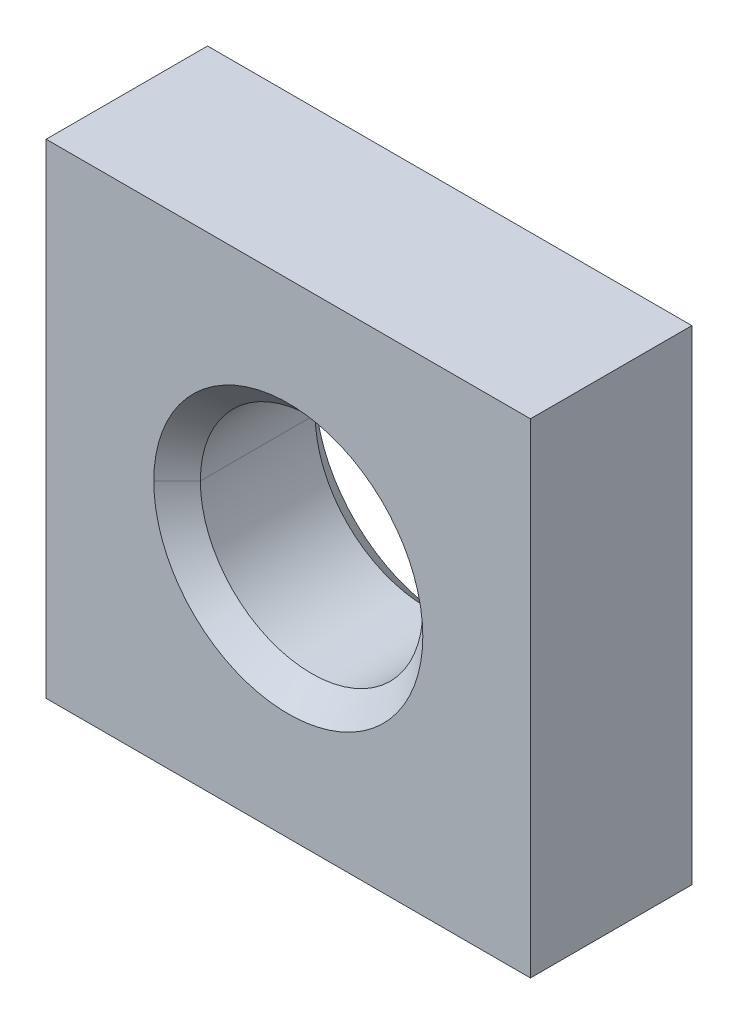
ISO-10303-21;
HEADER;
FILE_DESCRIPTION(('STEP AP214'),'2;1');
FILE_NAME('part.step','',(''),(''),'','','');
FILE_SCHEMA(('AUTOMOTIVE_DESIGN { 1 0 10303 214 1 1 1 1 }'));
ENDSEC;
DATA;
#1=APPLICATION_CONTEXT('core data for automotive mechanical design processes');
#2=APPLICATION_PROTOCOL_DEFINITION('international standard','automotive_design',2000,#1);
#3=PRODUCT_CONTEXT('',#1,'mechanical');
#4=PRODUCT('Part','Part','',(#3));
#5=PRODUCT_RELATED_PRODUCT_CATEGORY('part','',(#4));
#6=PRODUCT_DEFINITION_FORMATION('','',#4);
#7=PRODUCT_DEFINITION_CONTEXT('part definition',#1,'design');
#8=PRODUCT_DEFINITION('design','',#6,#7);
#9=PRODUCT_DEFINITION_SHAPE('','',#8);
#10=(LENGTH_UNIT() NAMED_UNIT(*) SI_UNIT(.MILLI.,.METRE.));
#11=(NAMED_UNIT(*) PLANE_ANGLE_UNIT() SI_UNIT($,.RADIAN.));
#12=(NAMED_UNIT(*) SI_UNIT($,.STERADIAN.) SOLID_ANGLE_UNIT());
#13=UNCERTAINTY_MEASURE_WITH_UNIT(LENGTH_MEASURE(1.E-05),#10,'distance_accuracy_value','');
#14=(GEOMETRIC_REPRESENTATION_CONTEXT(3) GLOBAL_UNCERTAINTY_ASSIGNED_CONTEXT((#13)) GLOBAL_UNIT_ASSIGNED_CONTEXT((#10,
#11,#12)) REPRESENTATION_CONTEXT('',''));
#15=CARTESIAN_POINT('',(0.,0.,0.));
#16=DIRECTION('',(0.,0.,1.));
#17=DIRECTION('',(1.,0.,0.));
#18=AXIS2_PLACEMENT_3D('',#15,#16,#17);
#19=CARTESIAN_POINT('',(0.,0.,-3.));
#20=DIRECTION('',(0.,0.,1.));
#21=DIRECTION('',(1.,0.,0.));
#22=AXIS2_PLACEMENT_3D('',#19,#20,#21);
#23=PLANE('',#22);
#24=CARTESIAN_POINT('',(0.,0.,-3.));
#25=DIRECTION('',(0.,0.,-1.));
#26=DIRECTION('',(-1.,0.,0.));
#27=AXIS2_PLACEMENT_3D('',#24,#25,#26);
#28=CIRCLE('',#27,2.5);
#29=CARTESIAN_POINT('',(-2.5,0.,-3.));
#30=VERTEX_POINT('',#29);
#31=CARTESIAN_POINT('',(2.5000000000011,0.,-2.9999999999989));
#32=VERTEX_POINT('',#31);
#33=EDGE_CURVE('E10',#30,#32,#28,.T.);
#34=ORIENTED_EDGE('',*,*,#33,.F.);
#35=CARTESIAN_POINT('',(0.,0.,-3.));
#36=DIRECTION('',(0.,0.,-1.));
#37=DIRECTION('',(-1.,0.,0.));
#38=AXIS2_PLACEMENT_3D('',#35,#36,#37);
#39=CIRCLE('',#38,2.5);
#40=EDGE_CURVE('E24',#32,#30,#39,.T.);
#41=ORIENTED_EDGE('',*,*,#40,.F.);
#42=EDGE_LOOP('',(#34,#41));
#43=FACE_BOUND('',#42,.T.);
#44=DIRECTION('',(-1.,0.,0.));
#45=VECTOR('',#44,1.);
#46=CARTESIAN_POINT('',(4.5,4.5,-3.));
#47=LINE('',#46,#45);
#48=CARTESIAN_POINT('',(4.5,4.5,-3.));
#49=VERTEX_POINT('',#48);
#50=CARTESIAN_POINT('',(-4.5,4.5,-3.));
#51=VERTEX_POINT('',#50);
#52=EDGE_CURVE('E185',#49,#51,#47,.T.);
#53=ORIENTED_EDGE('',*,*,#52,.F.);
#54=DIRECTION('',(0.,1.,0.));
#55=VECTOR('',#54,1.);
#56=CARTESIAN_POINT('',(4.5,-4.5,-3.));
#57=LINE('',#56,#55);
#58=CARTESIAN_POINT('',(4.5,-4.5,-3.));
#59=VERTEX_POINT('',#58);
#60=EDGE_CURVE('E180',#59,#49,#57,.T.);
#61=ORIENTED_EDGE('',*,*,#60,.F.);
#62=DIRECTION('',(1.,0.,0.));
#63=VECTOR('',#62,1.);
#64=CARTESIAN_POINT('',(-4.5,-4.5,-3.));
#65=LINE('',#64,#63);
#66=CARTESIAN_POINT('',(-4.5,-4.5,-3.));
#67=VERTEX_POINT('',#66);
#68=EDGE_CURVE('E175',#67,#59,#65,.T.);
#69=ORIENTED_EDGE('',*,*,#68,.F.);
#70=DIRECTION('',(0.,-1.,0.));
#71=VECTOR('',#70,1.);
#72=CARTESIAN_POINT('',(-4.5,4.5,-3.));
#73=LINE('',#72,#71);
#74=EDGE_CURVE('E170',#51,#67,#73,.T.);
#75=ORIENTED_EDGE('',*,*,#74,.F.);
#76=EDGE_LOOP('',(#53,#61,#69,#75));
#77=FACE_BOUND('',#76,.T.);
#78=ADVANCED_FACE('F16',(#43,#77),#23,.F.);
#79=CARTESIAN_POINT('',(-4.5,4.5,-3.));
#80=DIRECTION('',(-1.,0.,0.));
#81=DIRECTION('',(0.,0.,1.));
#82=AXIS2_PLACEMENT_3D('',#79,#80,#81);
#83=PLANE('',#82);
#84=DIRECTION('',(0.,-1.,0.));
#85=VECTOR('',#84,1.);
#86=CARTESIAN_POINT('',(-4.5,4.5,0.));
#87=LINE('',#86,#85);
#88=CARTESIAN_POINT('',(-4.5,4.5,0.));
#89=VERTEX_POINT('',#88);
#90=CARTESIAN_POINT('',(-4.5,-4.5,0.));
#91=VERTEX_POINT('',#90);
#92=EDGE_CURVE('E165',#89,#91,#87,.T.);
#93=ORIENTED_EDGE('',*,*,#92,.F.);
#94=DIRECTION('',(0.,0.,1.));
#95=VECTOR('',#94,1.);
#96=CARTESIAN_POINT('',(-4.5,4.5,-3.));
#97=LINE('',#96,#95);
#98=EDGE_CURVE('E160',#51,#89,#97,.T.);
#99=ORIENTED_EDGE('',*,*,#98,.F.);
#100=ORIENTED_EDGE('',*,*,#74,.T.);
#101=DIRECTION('',(0.,0.,1.));
#102=VECTOR('',#101,1.);
#103=CARTESIAN_POINT('',(-4.5,-4.5,-3.));
#104=LINE('',#103,#102);
#105=EDGE_CURVE('E156',#67,#91,#104,.T.);
#106=ORIENTED_EDGE('',*,*,#105,.T.);
#107=EDGE_LOOP('',(#93,#99,#100,#106));
#108=FACE_BOUND('',#107,.T.);
#109=ADVANCED_FACE('F209',(#108),#83,.T.);
#110=CARTESIAN_POINT('',(-4.5,-4.5,-3.));
#111=DIRECTION('',(0.,-1.,0.));
#112=DIRECTION('',(0.,0.,-1.));
#113=AXIS2_PLACEMENT_3D('',#110,#111,#112);
#114=PLANE('',#113);
#115=DIRECTION('',(1.,0.,0.));
#116=VECTOR('',#115,1.);
#117=CARTESIAN_POINT('',(-4.5,-4.5,0.));
#118=LINE('',#117,#116);
#119=CARTESIAN_POINT('',(4.5,-4.5,0.));
#120=VERTEX_POINT('',#119);
#121=EDGE_CURVE('E151',#91,#120,#118,.T.);
#122=ORIENTED_EDGE('',*,*,#121,.F.);
#123=ORIENTED_EDGE('',*,*,#105,.F.);
#124=ORIENTED_EDGE('',*,*,#68,.T.);
#125=DIRECTION('',(0.,0.,1.));
#126=VECTOR('',#125,1.);
#127=CARTESIAN_POINT('',(4.5,-4.5,-3.));
#128=LINE('',#127,#126);
#129=EDGE_CURVE('E147',#59,#120,#128,.T.);
#130=ORIENTED_EDGE('',*,*,#129,.T.);
#131=EDGE_LOOP('',(#122,#123,#124,#130));
#132=FACE_BOUND('',#131,.T.);
#133=ADVANCED_FACE('F206',(#132),#114,.T.);
#134=CARTESIAN_POINT('',(4.5,-4.5,-3.));
#135=DIRECTION('',(1.,0.,0.));
#136=DIRECTION('',(0.,0.,-1.));
#137=AXIS2_PLACEMENT_3D('',#134,#135,#136);
#138=PLANE('',#137);
#139=DIRECTION('',(0.,1.,0.));
#140=VECTOR('',#139,1.);
#141=CARTESIAN_POINT('',(4.5,-4.5,0.));
#142=LINE('',#141,#140);
#143=CARTESIAN_POINT('',(4.5,4.5,0.));
#144=VERTEX_POINT('',#143);
#145=EDGE_CURVE('E142',#120,#144,#142,.T.);
#146=ORIENTED_EDGE('',*,*,#145,.F.);
#147=ORIENTED_EDGE('',*,*,#129,.F.);
#148=ORIENTED_EDGE('',*,*,#60,.T.);
#149=DIRECTION('',(0.,0.,1.));
#150=VECTOR('',#149,1.);
#151=CARTESIAN_POINT('',(4.5,4.5,-3.));
#152=LINE('',#151,#150);
#153=EDGE_CURVE('E138',#49,#144,#152,.T.);
#154=ORIENTED_EDGE('',*,*,#153,.T.);
#155=EDGE_LOOP('',(#146,#147,#148,#154));
#156=FACE_BOUND('',#155,.T.);
#157=ADVANCED_FACE('F203',(#156),#138,.T.);
#158=CARTESIAN_POINT('',(4.5,4.5,-3.));
#159=DIRECTION('',(0.,1.,0.));
#160=DIRECTION('',(0.,0.,1.));
#161=AXIS2_PLACEMENT_3D('',#158,#159,#160);
#162=PLANE('',#161);
#163=DIRECTION('',(-1.,0.,0.));
#164=VECTOR('',#163,1.);
#165=CARTESIAN_POINT('',(4.5,4.5,0.));
#166=LINE('',#165,#164);
#167=EDGE_CURVE('E133',#144,#89,#166,.T.);
#168=ORIENTED_EDGE('',*,*,#167,.F.);
#169=ORIENTED_EDGE('',*,*,#153,.F.);
#170=ORIENTED_EDGE('',*,*,#52,.T.);
#171=ORIENTED_EDGE('',*,*,#98,.T.);
#172=EDGE_LOOP('',(#168,#169,#170,#171));
#173=FACE_BOUND('',#172,.T.);
#174=ADVANCED_FACE('F197',(#173),#162,.T.);
#175=CARTESIAN_POINT('',(0.,0.,0.));
#176=DIRECTION('',(0.,0.,1.));
#177=DIRECTION('',(1.,0.,0.));
#178=AXIS2_PLACEMENT_3D('',#175,#176,#177);
#179=PLANE('',#178);
#180=CARTESIAN_POINT('',(0.,0.,0.));
#181=DIRECTION('',(0.,0.,-1.));
#182=DIRECTION('',(-1.,0.,0.));
#183=AXIS2_PLACEMENT_3D('',#180,#181,#182);
#184=CIRCLE('',#183,2.5);
#185=CARTESIAN_POINT('',(-2.5,0.,0.));
#186=VERTEX_POINT('',#185);
#187=CARTESIAN_POINT('',(2.5,0.,0.));
#188=VERTEX_POINT('',#187);
#189=EDGE_CURVE('E129',#186,#188,#184,.T.);
#190=ORIENTED_EDGE('',*,*,#189,.T.);
#191=CARTESIAN_POINT('',(0.,0.,0.));
#192=DIRECTION('',(0.,0.,-1.));
#193=DIRECTION('',(-1.,0.,0.));
#194=AXIS2_PLACEMENT_3D('',#191,#192,#193);
#195=CIRCLE('',#194,2.5);
#196=EDGE_CURVE('E125',#188,#186,#195,.T.);
#197=ORIENTED_EDGE('',*,*,#196,.T.);
#198=EDGE_LOOP('',(#190,#197));
#199=FACE_BOUND('',#198,.T.);
#200=ORIENTED_EDGE('',*,*,#167,.T.);
#201=ORIENTED_EDGE('',*,*,#92,.T.);
#202=ORIENTED_EDGE('',*,*,#121,.T.);
#203=ORIENTED_EDGE('',*,*,#145,.T.);
#204=EDGE_LOOP('',(#200,#201,#202,#203));
#205=FACE_BOUND('',#204,.T.);
#206=ADVANCED_FACE('F211',(#199,#205),#179,.T.);
#207=CARTESIAN_POINT('',(0.,0.,0.));
#208=DIRECTION('',(0.,0.,1.));
#209=DIRECTION('',(0.,1.,0.));
#210=AXIS2_PLACEMENT_3D('',#207,#208,#209);
#211=CONICAL_SURFACE('',#210,2.5,0.7853981634);
#212=ORIENTED_EDGE('',*,*,#196,.F.);
#213=DIRECTION('',(0.707106781188352,0.,0.707106781184743));
#214=VECTOR('',#213,1.);
#215=CARTESIAN_POINT('',(2.0669999999989,0.,-0.432999999998895));
#216=LINE('',#215,#214);
#217=CARTESIAN_POINT('',(2.0669999999989,0.,-0.432999999998895));
#218=VERTEX_POINT('',#217);
#219=EDGE_CURVE('E120',#218,#188,#216,.T.);
#220=ORIENTED_EDGE('',*,*,#219,.F.);
#221=CARTESIAN_POINT('',(0.,0.,-0.433));
#222=DIRECTION('',(0.,0.,-1.));
#223=DIRECTION('',(-1.,0.,0.));
#224=AXIS2_PLACEMENT_3D('',#221,#222,#223);
#225=CIRCLE('',#224,2.067);
#226=CARTESIAN_POINT('',(-2.067,0.,-0.433));
#227=VERTEX_POINT('',#226);
#228=EDGE_CURVE('E116',#218,#227,#225,.T.);
#229=ORIENTED_EDGE('',*,*,#228,.T.);
#230=DIRECTION('',(-0.707106781188352,0.,0.707106781184743));
#231=VECTOR('',#230,1.);
#232=CARTESIAN_POINT('',(-2.0669999999989,0.,-0.432999999998895));
#233=LINE('',#232,#231);
#234=EDGE_CURVE('E104',#227,#186,#233,.T.);
#235=ORIENTED_EDGE('',*,*,#234,.T.);
#236=EDGE_LOOP('',(#212,#220,#229,#235));
#237=FACE_BOUND('',#236,.T.);
#238=ADVANCED_FACE('F213',(#237),#211,.F.);
#239=CARTESIAN_POINT('',(0.,0.,0.));
#240=DIRECTION('',(0.,0.,1.));
#241=DIRECTION('',(0.,-1.,0.));
#242=AXIS2_PLACEMENT_3D('',#239,#240,#241);
#243=CONICAL_SURFACE('',#242,2.5,0.7853981634);
#244=CARTESIAN_POINT('',(0.,0.,-0.433));
#245=DIRECTION('',(0.,0.,-1.));
#246=DIRECTION('',(-1.,0.,0.));
#247=AXIS2_PLACEMENT_3D('',#244,#245,#246);
#248=CIRCLE('',#247,2.067);
#249=EDGE_CURVE('E84',#227,#218,#248,.T.);
#250=ORIENTED_EDGE('',*,*,#249,.T.);
#251=ORIENTED_EDGE('',*,*,#219,.T.);
#252=ORIENTED_EDGE('',*,*,#189,.F.);
#253=ORIENTED_EDGE('',*,*,#234,.F.);
#254=EDGE_LOOP('',(#250,#251,#252,#253));
#255=FACE_BOUND('',#254,.T.);
#256=ADVANCED_FACE('F221',(#255),#243,.F.);
#257=CARTESIAN_POINT('',(0.,0.,-3.));
#258=DIRECTION('',(0.,0.,1.));
#259=DIRECTION('',(0.,-1.,0.));
#260=AXIS2_PLACEMENT_3D('',#257,#258,#259);
#261=CYLINDRICAL_SURFACE('',#260,2.067);
#262=CARTESIAN_POINT('',(0.,0.,-2.567));
#263=DIRECTION('',(0.,0.,-1.));
#264=DIRECTION('',(-1.,0.,0.));
#265=AXIS2_PLACEMENT_3D('',#262,#263,#264);
#266=CIRCLE('',#265,2.067);
#267=CARTESIAN_POINT('',(-2.067,0.,-2.567));
#268=VERTEX_POINT('',#267);
#269=CARTESIAN_POINT('',(2.067,0.,-2.567));
#270=VERTEX_POINT('',#269);
#271=EDGE_CURVE('E81',#268,#270,#266,.T.);
#272=ORIENTED_EDGE('',*,*,#271,.T.);
#273=DIRECTION('',(0.,0.,1.));
#274=VECTOR('',#273,1.);
#275=CARTESIAN_POINT('',(2.067,0.,-2.567));
#276=LINE('',#275,#274);
#277=EDGE_CURVE('E87',#270,#218,#276,.T.);
#278=ORIENTED_EDGE('',*,*,#277,.T.);
#279=ORIENTED_EDGE('',*,*,#249,.F.);
#280=DIRECTION('',(0.,0.,1.));
#281=VECTOR('',#280,1.);
#282=CARTESIAN_POINT('',(-2.067,0.,-2.567));
#283=LINE('',#282,#281);
#284=EDGE_CURVE('E76',#268,#227,#283,.T.);
#285=ORIENTED_EDGE('',*,*,#284,.F.);
#286=EDGE_LOOP('',(#272,#278,#279,#285));
#287=FACE_BOUND('',#286,.T.);
#288=ADVANCED_FACE('F78',(#287),#261,.F.);
#289=CARTESIAN_POINT('',(0.,0.,-3.));
#290=DIRECTION('',(0.,0.,1.));
#291=DIRECTION('',(0.,1.,0.));
#292=AXIS2_PLACEMENT_3D('',#289,#290,#291);
#293=CYLINDRICAL_SURFACE('',#292,2.067);
#294=ORIENTED_EDGE('',*,*,#228,.F.);
#295=ORIENTED_EDGE('',*,*,#277,.F.);
#296=CARTESIAN_POINT('',(0.,0.,-2.567));
#297=DIRECTION('',(0.,0.,-1.));
#298=DIRECTION('',(-1.,0.,0.));
#299=AXIS2_PLACEMENT_3D('',#296,#297,#298);
#300=CIRCLE('',#299,2.067);
#301=EDGE_CURVE('E88',#270,#268,#300,.T.);
#302=ORIENTED_EDGE('',*,*,#301,.T.);
#303=ORIENTED_EDGE('',*,*,#284,.T.);
#304=EDGE_LOOP('',(#294,#295,#302,#303));
#305=FACE_BOUND('',#304,.T.);
#306=ADVANCED_FACE('F92',(#305),#293,.F.);
#307=CARTESIAN_POINT('',(0.,0.,-2.567));
#308=DIRECTION('',(0.,0.,-1.));
#309=DIRECTION('',(0.,1.,0.));
#310=AXIS2_PLACEMENT_3D('',#307,#308,#309);
#311=CONICAL_SURFACE('',#310,2.067,0.7853981634);
#312=ORIENTED_EDGE('',*,*,#301,.F.);
#313=DIRECTION('',(0.707106781188352,0.,-0.707106781184743));
#314=VECTOR('',#313,1.);
#315=CARTESIAN_POINT('',(2.067,0.,-2.567));
#316=LINE('',#315,#314);
#317=EDGE_CURVE('E95',#270,#32,#316,.T.);
#318=ORIENTED_EDGE('',*,*,#317,.T.);
#319=ORIENTED_EDGE('',*,*,#40,.T.);
#320=DIRECTION('',(-0.707106781188352,0.,-0.707106781184743));
#321=VECTOR('',#320,1.);
#322=CARTESIAN_POINT('',(-2.067,0.,-2.567));
#323=LINE('',#322,#321);
#324=EDGE_CURVE('E98',#268,#30,#323,.T.);
#325=ORIENTED_EDGE('',*,*,#324,.F.);
#326=EDGE_LOOP('',(#312,#318,#319,#325));
#327=FACE_BOUND('',#326,.T.);
#328=ADVANCED_FACE('F99',(#327),#311,.F.);
#329=CARTESIAN_POINT('',(0.,0.,-2.567));
#330=DIRECTION('',(0.,0.,-1.));
#331=DIRECTION('',(0.,-1.,0.));
#332=AXIS2_PLACEMENT_3D('',#329,#330,#331);
#333=CONICAL_SURFACE('',#332,2.067,0.7853981634);
#334=ORIENTED_EDGE('',*,*,#33,.T.);
#335=ORIENTED_EDGE('',*,*,#317,.F.);
#336=ORIENTED_EDGE('',*,*,#271,.F.);
#337=ORIENTED_EDGE('',*,*,#324,.T.);
#338=EDGE_LOOP('',(#334,#335,#336,#337));
#339=FACE_BOUND('',#338,.T.);
#340=ADVANCED_FACE('F102',(#339),#333,.F.);
#341=CLOSED_SHELL('',(#78,#109,#133,#157,#174,#206,#238,#256,#288,#306,#328,#340));
#342=MANIFOLD_SOLID_BREP('B1',#341);
#343=ADVANCED_BREP_SHAPE_REPRESENTATION('',(#18,#342),#14);
#344=SHAPE_DEFINITION_REPRESENTATION(#9,#343);
ENDSEC;
END-ISO-10303-21;
